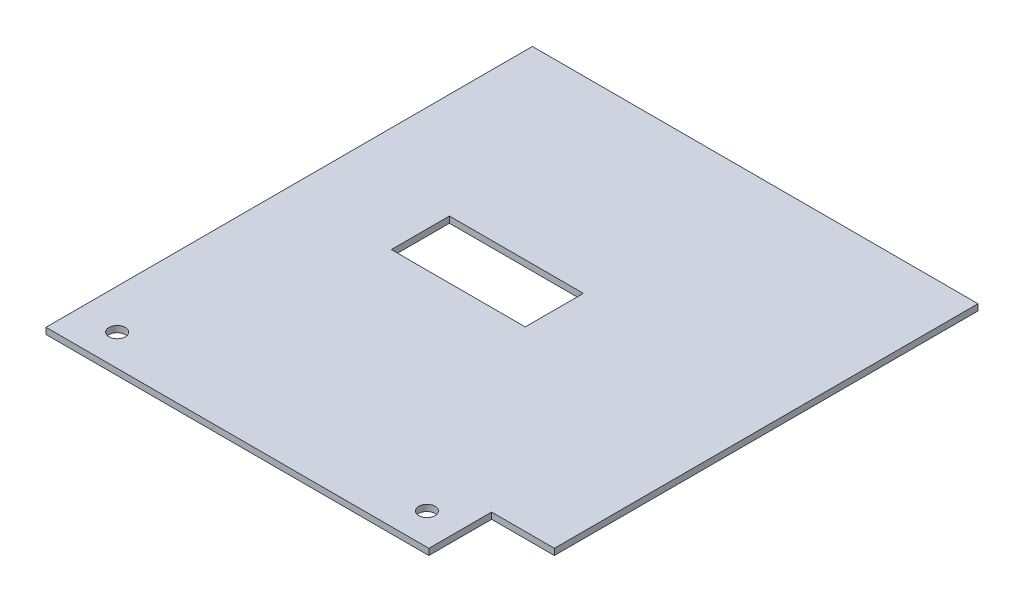
ISO-10303-21;
HEADER;
FILE_DESCRIPTION(('STEP AP214'),'2;1');
FILE_NAME('part.step','',(''),(''),'','','');
FILE_SCHEMA(('AUTOMOTIVE_DESIGN { 1 0 10303 214 1 1 1 1 }'));
ENDSEC;
DATA;
#1=APPLICATION_CONTEXT('core data for automotive mechanical design processes');
#2=APPLICATION_PROTOCOL_DEFINITION('international standard','automotive_design',2000,#1);
#3=PRODUCT_CONTEXT('',#1,'mechanical');
#4=PRODUCT('Part','Part','',(#3));
#5=PRODUCT_RELATED_PRODUCT_CATEGORY('part','',(#4));
#6=PRODUCT_DEFINITION_FORMATION('','',#4);
#7=PRODUCT_DEFINITION_CONTEXT('part definition',#1,'design');
#8=PRODUCT_DEFINITION('design','',#6,#7);
#9=PRODUCT_DEFINITION_SHAPE('','',#8);
#10=(LENGTH_UNIT() NAMED_UNIT(*) SI_UNIT(.MILLI.,.METRE.));
#11=(NAMED_UNIT(*) PLANE_ANGLE_UNIT() SI_UNIT($,.RADIAN.));
#12=(NAMED_UNIT(*) SI_UNIT($,.STERADIAN.) SOLID_ANGLE_UNIT());
#13=UNCERTAINTY_MEASURE_WITH_UNIT(LENGTH_MEASURE(1.E-05),#10,'distance_accuracy_value','');
#14=(GEOMETRIC_REPRESENTATION_CONTEXT(3) GLOBAL_UNCERTAINTY_ASSIGNED_CONTEXT((#13)) GLOBAL_UNIT_ASSIGNED_CONTEXT((#10,
#11,#12)) REPRESENTATION_CONTEXT('',''));
#15=CARTESIAN_POINT('',(0.,0.,0.));
#16=DIRECTION('',(0.,0.,1.));
#17=DIRECTION('',(1.,0.,0.));
#18=AXIS2_PLACEMENT_3D('',#15,#16,#17);
#19=CARTESIAN_POINT('',(-70.0456120409134,2.,76.4582384953632));
#20=DIRECTION('',(1.,0.,0.));
#21=DIRECTION('',(0.,0.,-1.));
#22=AXIS2_PLACEMENT_3D('',#19,#20,#21);
#23=PLANE('',#22);
#24=DIRECTION('',(0.,0.,1.));
#25=VECTOR('',#24,1.);
#26=CARTESIAN_POINT('',(-70.0456120409134,0.,76.4582384953632));
#27=LINE('',#26,#25);
#28=CARTESIAN_POINT('',(-70.0456120409134,0.,-78.5417615046368));
#29=VERTEX_POINT('',#28);
#30=CARTESIAN_POINT('',(-70.0456120409134,0.,76.4582384953632));
#31=VERTEX_POINT('',#30);
#32=EDGE_CURVE('E146',#29,#31,#27,.T.);
#33=ORIENTED_EDGE('',*,*,#32,.T.);
#34=DIRECTION('',(0.,-1.,0.));
#35=VECTOR('',#34,1.);
#36=CARTESIAN_POINT('',(-70.0456120409134,2.,76.4582384953632));
#37=LINE('',#36,#35);
#38=CARTESIAN_POINT('',(-70.0456120409134,2.,76.4582384953632));
#39=VERTEX_POINT('',#38);
#40=EDGE_CURVE('E11',#39,#31,#37,.T.);
#41=ORIENTED_EDGE('',*,*,#40,.F.);
#42=DIRECTION('',(0.,0.,1.));
#43=VECTOR('',#42,1.);
#44=CARTESIAN_POINT('',(-70.0456120409134,2.,76.4582384953632));
#45=LINE('',#44,#43);
#46=CARTESIAN_POINT('',(-70.0456120409134,2.,-78.5417615046368));
#47=VERTEX_POINT('',#46);
#48=EDGE_CURVE('E150',#47,#39,#45,.T.);
#49=ORIENTED_EDGE('',*,*,#48,.F.);
#50=DIRECTION('',(0.,-1.,0.));
#51=VECTOR('',#50,1.);
#52=CARTESIAN_POINT('',(-70.0456120409134,2.,-78.5417615046368));
#53=LINE('',#52,#51);
#54=EDGE_CURVE('E164',#47,#29,#53,.T.);
#55=ORIENTED_EDGE('',*,*,#54,.T.);
#56=EDGE_LOOP('',(#33,#41,#49,#55));
#57=FACE_BOUND('',#56,.T.);
#58=ADVANCED_FACE('F33',(#57),#23,.F.);
#59=CARTESIAN_POINT('',(51.9543879590866,2.,76.4582384953632));
#60=DIRECTION('',(0.,0.,-1.));
#61=DIRECTION('',(-1.,0.,0.));
#62=AXIS2_PLACEMENT_3D('',#59,#60,#61);
#63=PLANE('',#62);
#64=DIRECTION('',(1.,0.,0.));
#65=VECTOR('',#64,1.);
#66=CARTESIAN_POINT('',(51.9543879590866,0.,76.4582384953632));
#67=LINE('',#66,#65);
#68=CARTESIAN_POINT('',(51.9543879590866,0.,76.4582384953632));
#69=VERTEX_POINT('',#68);
#70=EDGE_CURVE('E167',#31,#69,#67,.T.);
#71=ORIENTED_EDGE('',*,*,#70,.T.);
#72=DIRECTION('',(0.,-1.,0.));
#73=VECTOR('',#72,1.);
#74=CARTESIAN_POINT('',(51.9543879590866,2.,76.4582384953632));
#75=LINE('',#74,#73);
#76=CARTESIAN_POINT('',(51.9543879590866,2.,76.4582384953632));
#77=VERTEX_POINT('',#76);
#78=EDGE_CURVE('E40',#77,#69,#75,.T.);
#79=ORIENTED_EDGE('',*,*,#78,.F.);
#80=DIRECTION('',(1.,0.,0.));
#81=VECTOR('',#80,1.);
#82=CARTESIAN_POINT('',(51.9543879590866,2.,76.4582384953632));
#83=LINE('',#82,#81);
#84=EDGE_CURVE('E153',#39,#77,#83,.T.);
#85=ORIENTED_EDGE('',*,*,#84,.F.);
#86=ORIENTED_EDGE('',*,*,#40,.T.);
#87=EDGE_LOOP('',(#71,#79,#85,#86));
#88=FACE_BOUND('',#87,.T.);
#89=ADVANCED_FACE('F212',(#88),#63,.F.);
#90=CARTESIAN_POINT('',(51.9543879590866,2.,76.4582384953632));
#91=DIRECTION('',(-1.,0.,0.));
#92=DIRECTION('',(0.,0.,1.));
#93=AXIS2_PLACEMENT_3D('',#90,#91,#92);
#94=PLANE('',#93);
#95=DIRECTION('',(0.,0.,-1.));
#96=VECTOR('',#95,1.);
#97=CARTESIAN_POINT('',(51.9543879590866,0.,76.4582384953632));
#98=LINE('',#97,#96);
#99=CARTESIAN_POINT('',(51.9543879590866,0.,56.4582384953632));
#100=VERTEX_POINT('',#99);
#101=EDGE_CURVE('E169',#69,#100,#98,.T.);
#102=ORIENTED_EDGE('',*,*,#101,.T.);
#103=DIRECTION('',(0.,-1.,0.));
#104=VECTOR('',#103,1.);
#105=CARTESIAN_POINT('',(51.9543879590866,2.,56.4582384953632));
#106=LINE('',#105,#104);
#107=CARTESIAN_POINT('',(51.9543879590866,2.,56.4582384953632));
#108=VERTEX_POINT('',#107);
#109=EDGE_CURVE('E184',#108,#100,#106,.T.);
#110=ORIENTED_EDGE('',*,*,#109,.F.);
#111=DIRECTION('',(0.,0.,-1.));
#112=VECTOR('',#111,1.);
#113=CARTESIAN_POINT('',(51.9543879590866,2.,76.4582384953632));
#114=LINE('',#113,#112);
#115=EDGE_CURVE('E156',#77,#108,#114,.T.);
#116=ORIENTED_EDGE('',*,*,#115,.F.);
#117=ORIENTED_EDGE('',*,*,#78,.T.);
#118=EDGE_LOOP('',(#102,#110,#116,#117));
#119=FACE_BOUND('',#118,.T.);
#120=ADVANCED_FACE('F191',(#119),#94,.F.);
#121=CARTESIAN_POINT('',(71.9543879590866,2.,56.4582384953632));
#122=DIRECTION('',(0.,0.,-1.));
#123=DIRECTION('',(-1.,0.,0.));
#124=AXIS2_PLACEMENT_3D('',#121,#122,#123);
#125=PLANE('',#124);
#126=DIRECTION('',(1.,0.,0.));
#127=VECTOR('',#126,1.);
#128=CARTESIAN_POINT('',(71.9543879590866,0.,56.4582384953632));
#129=LINE('',#128,#127);
#130=CARTESIAN_POINT('',(71.9543879590866,0.,56.4582384953632));
#131=VERTEX_POINT('',#130);
#132=EDGE_CURVE('E171',#100,#131,#129,.T.);
#133=ORIENTED_EDGE('',*,*,#132,.T.);
#134=DIRECTION('',(0.,-1.,0.));
#135=VECTOR('',#134,1.);
#136=CARTESIAN_POINT('',(71.9543879590866,2.,56.4582384953632));
#137=LINE('',#136,#135);
#138=CARTESIAN_POINT('',(71.9543879590866,2.,56.4582384953632));
#139=VERTEX_POINT('',#138);
#140=EDGE_CURVE('E181',#139,#131,#137,.T.);
#141=ORIENTED_EDGE('',*,*,#140,.F.);
#142=DIRECTION('',(1.,0.,0.));
#143=VECTOR('',#142,1.);
#144=CARTESIAN_POINT('',(71.9543879590866,2.,56.4582384953632));
#145=LINE('',#144,#143);
#146=EDGE_CURVE('E158',#108,#139,#145,.T.);
#147=ORIENTED_EDGE('',*,*,#146,.F.);
#148=ORIENTED_EDGE('',*,*,#109,.T.);
#149=EDGE_LOOP('',(#133,#141,#147,#148));
#150=FACE_BOUND('',#149,.T.);
#151=ADVANCED_FACE('F200',(#150),#125,.F.);
#152=CARTESIAN_POINT('',(71.9543879590866,2.,56.4582384953632));
#153=DIRECTION('',(-1.,0.,0.));
#154=DIRECTION('',(0.,0.,1.));
#155=AXIS2_PLACEMENT_3D('',#152,#153,#154);
#156=PLANE('',#155);
#157=DIRECTION('',(0.,0.,-1.));
#158=VECTOR('',#157,1.);
#159=CARTESIAN_POINT('',(71.9543879590866,0.,56.4582384953632));
#160=LINE('',#159,#158);
#161=CARTESIAN_POINT('',(71.9543879590866,0.,-78.5417615046368));
#162=VERTEX_POINT('',#161);
#163=EDGE_CURVE('E173',#131,#162,#160,.T.);
#164=ORIENTED_EDGE('',*,*,#163,.T.);
#165=DIRECTION('',(0.,-1.,0.));
#166=VECTOR('',#165,1.);
#167=CARTESIAN_POINT('',(71.9543879590866,2.,-78.5417615046368));
#168=LINE('',#167,#166);
#169=CARTESIAN_POINT('',(71.9543879590866,2.,-78.5417615046368));
#170=VERTEX_POINT('',#169);
#171=EDGE_CURVE('E178',#170,#162,#168,.T.);
#172=ORIENTED_EDGE('',*,*,#171,.F.);
#173=DIRECTION('',(0.,0.,-1.));
#174=VECTOR('',#173,1.);
#175=CARTESIAN_POINT('',(71.9543879590866,2.,56.4582384953632));
#176=LINE('',#175,#174);
#177=EDGE_CURVE('E160',#139,#170,#176,.T.);
#178=ORIENTED_EDGE('',*,*,#177,.F.);
#179=ORIENTED_EDGE('',*,*,#140,.T.);
#180=EDGE_LOOP('',(#164,#172,#178,#179));
#181=FACE_BOUND('',#180,.T.);
#182=ADVANCED_FACE('F204',(#181),#156,.F.);
#183=CARTESIAN_POINT('',(71.9543879590866,2.,-78.5417615046368));
#184=DIRECTION('',(0.,0.,1.));
#185=DIRECTION('',(1.,0.,0.));
#186=AXIS2_PLACEMENT_3D('',#183,#184,#185);
#187=PLANE('',#186);
#188=DIRECTION('',(-1.,0.,0.));
#189=VECTOR('',#188,1.);
#190=CARTESIAN_POINT('',(71.9543879590866,0.,-78.5417615046368));
#191=LINE('',#190,#189);
#192=EDGE_CURVE('E154',#162,#29,#191,.T.);
#193=ORIENTED_EDGE('',*,*,#192,.T.);
#194=ORIENTED_EDGE('',*,*,#54,.F.);
#195=DIRECTION('',(-1.,0.,0.));
#196=VECTOR('',#195,1.);
#197=CARTESIAN_POINT('',(71.9543879590866,2.,-78.5417615046368));
#198=LINE('',#197,#196);
#199=EDGE_CURVE('E162',#170,#47,#198,.T.);
#200=ORIENTED_EDGE('',*,*,#199,.F.);
#201=ORIENTED_EDGE('',*,*,#171,.T.);
#202=EDGE_LOOP('',(#193,#194,#200,#201));
#203=FACE_BOUND('',#202,.T.);
#204=ADVANCED_FACE('F215',(#203),#187,.F.);
#205=CARTESIAN_POINT('',(0.,2.,0.));
#206=DIRECTION('',(0.,1.,0.));
#207=DIRECTION('',(0.,0.,1.));
#208=AXIS2_PLACEMENT_3D('',#205,#206,#207);
#209=PLANE('',#208);
#210=CARTESIAN_POINT('',(41.3378459643878,2.,66.4582384953632));
#211=DIRECTION('',(0.,-1.,0.));
#212=DIRECTION('',(0.,0.,-1.));
#213=AXIS2_PLACEMENT_3D('',#210,#211,#212);
#214=CIRCLE('',#213,2.6);
#215=CARTESIAN_POINT('',(41.3378459643878,2.,63.8582384953632));
#216=VERTEX_POINT('',#215);
#217=EDGE_CURVE('E140',#216,#216,#214,.T.);
#218=ORIENTED_EDGE('',*,*,#217,.T.);
#219=EDGE_LOOP('',(#218));
#220=FACE_BOUND('',#219,.T.);
#221=CARTESIAN_POINT('',(-57.370433400223,2.,66.4582384953632));
#222=DIRECTION('',(0.,-1.,0.));
#223=DIRECTION('',(0.,0.,-1.));
#224=AXIS2_PLACEMENT_3D('',#221,#222,#223);
#225=CIRCLE('',#224,2.6);
#226=CARTESIAN_POINT('',(-57.370433400223,2.,63.8582384953632));
#227=VERTEX_POINT('',#226);
#228=EDGE_CURVE('E323',#227,#227,#225,.T.);
#229=ORIENTED_EDGE('',*,*,#228,.T.);
#230=EDGE_LOOP('',(#229));
#231=FACE_BOUND('',#230,.T.);
#232=DIRECTION('',(0.,0.,-1.));
#233=VECTOR('',#232,1.);
#234=CARTESIAN_POINT('',(6.21509451052304,2.,-18.521827686925));
#235=LINE('',#234,#233);
#236=CARTESIAN_POINT('',(6.21509451052305,2.,0.));
#237=VERTEX_POINT('',#236);
#238=CARTESIAN_POINT('',(6.21509451052304,2.,-18.521827686925));
#239=VERTEX_POINT('',#238);
#240=EDGE_CURVE('E47',#237,#239,#235,.T.);
#241=ORIENTED_EDGE('',*,*,#240,.F.);
#242=DIRECTION('',(1.,0.,0.));
#243=VECTOR('',#242,1.);
#244=CARTESIAN_POINT('',(6.21509451052305,2.,0.));
#245=LINE('',#244,#243);
#246=CARTESIAN_POINT('',(-36.4702029381903,2.,0.));
#247=VERTEX_POINT('',#246);
#248=EDGE_CURVE('E127',#247,#237,#245,.T.);
#249=ORIENTED_EDGE('',*,*,#248,.F.);
#250=DIRECTION('',(0.,0.,1.));
#251=VECTOR('',#250,1.);
#252=CARTESIAN_POINT('',(-36.4702029381903,2.,-18.521827686925));
#253=LINE('',#252,#251);
#254=CARTESIAN_POINT('',(-36.4702029381903,2.,-18.521827686925));
#255=VERTEX_POINT('',#254);
#256=EDGE_CURVE('E130',#255,#247,#253,.T.);
#257=ORIENTED_EDGE('',*,*,#256,.F.);
#258=DIRECTION('',(-1.,0.,0.));
#259=VECTOR('',#258,1.);
#260=CARTESIAN_POINT('',(6.21509451052304,2.,-18.521827686925));
#261=LINE('',#260,#259);
#262=EDGE_CURVE('E139',#239,#255,#261,.T.);
#263=ORIENTED_EDGE('',*,*,#262,.F.);
#264=EDGE_LOOP('',(#241,#249,#257,#263));
#265=FACE_BOUND('',#264,.T.);
#266=ORIENTED_EDGE('',*,*,#48,.T.);
#267=ORIENTED_EDGE('',*,*,#84,.T.);
#268=ORIENTED_EDGE('',*,*,#115,.T.);
#269=ORIENTED_EDGE('',*,*,#146,.T.);
#270=ORIENTED_EDGE('',*,*,#177,.T.);
#271=ORIENTED_EDGE('',*,*,#199,.T.);
#272=EDGE_LOOP('',(#266,#267,#268,#269,#270,#271));
#273=FACE_BOUND('',#272,.T.);
#274=ADVANCED_FACE('F208',(#220,#231,#265,#273),#209,.T.);
#275=CARTESIAN_POINT('',(0.,0.,0.));
#276=DIRECTION('',(0.,1.,0.));
#277=DIRECTION('',(0.,0.,1.));
#278=AXIS2_PLACEMENT_3D('',#275,#276,#277);
#279=PLANE('',#278);
#280=CARTESIAN_POINT('',(41.3378459643878,0.,66.4582384953632));
#281=DIRECTION('',(0.,-1.,0.));
#282=DIRECTION('',(0.,0.,-1.));
#283=AXIS2_PLACEMENT_3D('',#280,#281,#282);
#284=CIRCLE('',#283,2.6);
#285=CARTESIAN_POINT('',(41.3378459643878,0.,63.8582384953632));
#286=VERTEX_POINT('',#285);
#287=EDGE_CURVE('E322',#286,#286,#284,.T.);
#288=ORIENTED_EDGE('',*,*,#287,.F.);
#289=EDGE_LOOP('',(#288));
#290=FACE_BOUND('',#289,.T.);
#291=CARTESIAN_POINT('',(-57.370433400223,0.,66.4582384953632));
#292=DIRECTION('',(0.,-1.,0.));
#293=DIRECTION('',(0.,0.,-1.));
#294=AXIS2_PLACEMENT_3D('',#291,#292,#293);
#295=CIRCLE('',#294,2.6);
#296=CARTESIAN_POINT('',(-57.370433400223,0.,63.8582384953632));
#297=VERTEX_POINT('',#296);
#298=EDGE_CURVE('E133',#297,#297,#295,.T.);
#299=ORIENTED_EDGE('',*,*,#298,.F.);
#300=EDGE_LOOP('',(#299));
#301=FACE_BOUND('',#300,.T.);
#302=DIRECTION('',(1.,0.,0.));
#303=VECTOR('',#302,1.);
#304=CARTESIAN_POINT('',(6.21509451052305,0.,0.));
#305=LINE('',#304,#303);
#306=CARTESIAN_POINT('',(-36.4702029381903,0.,0.));
#307=VERTEX_POINT('',#306);
#308=CARTESIAN_POINT('',(6.21509451052305,0.,0.));
#309=VERTEX_POINT('',#308);
#310=EDGE_CURVE('E117',#307,#309,#305,.T.);
#311=ORIENTED_EDGE('',*,*,#310,.T.);
#312=DIRECTION('',(0.,0.,-1.));
#313=VECTOR('',#312,1.);
#314=CARTESIAN_POINT('',(6.21509451052304,0.,-18.521827686925));
#315=LINE('',#314,#313);
#316=CARTESIAN_POINT('',(6.21509451052304,0.,-18.521827686925));
#317=VERTEX_POINT('',#316);
#318=EDGE_CURVE('E111',#309,#317,#315,.T.);
#319=ORIENTED_EDGE('',*,*,#318,.T.);
#320=DIRECTION('',(-1.,0.,0.));
#321=VECTOR('',#320,1.);
#322=CARTESIAN_POINT('',(6.21509451052304,0.,-18.521827686925));
#323=LINE('',#322,#321);
#324=CARTESIAN_POINT('',(-36.4702029381903,0.,-18.521827686925));
#325=VERTEX_POINT('',#324);
#326=EDGE_CURVE('E120',#317,#325,#323,.T.);
#327=ORIENTED_EDGE('',*,*,#326,.T.);
#328=DIRECTION('',(0.,0.,1.));
#329=VECTOR('',#328,1.);
#330=CARTESIAN_POINT('',(-36.4702029381903,0.,-18.521827686925));
#331=LINE('',#330,#329);
#332=EDGE_CURVE('E55',#325,#307,#331,.T.);
#333=ORIENTED_EDGE('',*,*,#332,.T.);
#334=EDGE_LOOP('',(#311,#319,#327,#333));
#335=FACE_BOUND('',#334,.T.);
#336=ORIENTED_EDGE('',*,*,#32,.F.);
#337=ORIENTED_EDGE('',*,*,#192,.F.);
#338=ORIENTED_EDGE('',*,*,#163,.F.);
#339=ORIENTED_EDGE('',*,*,#132,.F.);
#340=ORIENTED_EDGE('',*,*,#101,.F.);
#341=ORIENTED_EDGE('',*,*,#70,.F.);
#342=EDGE_LOOP('',(#336,#337,#338,#339,#340,#341));
#343=FACE_BOUND('',#342,.T.);
#344=ADVANCED_FACE('F124',(#290,#301,#335,#343),#279,.F.);
#345=CARTESIAN_POINT('',(6.21509451052304,0.,-18.521827686925));
#346=DIRECTION('',(1.,0.,0.));
#347=DIRECTION('',(0.,0.,-1.));
#348=AXIS2_PLACEMENT_3D('',#345,#346,#347);
#349=PLANE('',#348);
#350=ORIENTED_EDGE('',*,*,#240,.T.);
#351=DIRECTION('',(0.,1.,0.));
#352=VECTOR('',#351,1.);
#353=CARTESIAN_POINT('',(6.21509451052304,0.,-18.521827686925));
#354=LINE('',#353,#352);
#355=EDGE_CURVE('E107',#317,#239,#354,.T.);
#356=ORIENTED_EDGE('',*,*,#355,.F.);
#357=ORIENTED_EDGE('',*,*,#318,.F.);
#358=DIRECTION('',(0.,1.,0.));
#359=VECTOR('',#358,1.);
#360=CARTESIAN_POINT('',(6.21509451052305,0.,0.));
#361=LINE('',#360,#359);
#362=EDGE_CURVE('E144',#309,#237,#361,.T.);
#363=ORIENTED_EDGE('',*,*,#362,.T.);
#364=EDGE_LOOP('',(#350,#356,#357,#363));
#365=FACE_BOUND('',#364,.T.);
#366=ADVANCED_FACE('F109',(#365),#349,.F.);
#367=CARTESIAN_POINT('',(6.21509451052305,0.,0.));
#368=DIRECTION('',(0.,0.,1.));
#369=DIRECTION('',(1.,0.,0.));
#370=AXIS2_PLACEMENT_3D('',#367,#368,#369);
#371=PLANE('',#370);
#372=ORIENTED_EDGE('',*,*,#248,.T.);
#373=ORIENTED_EDGE('',*,*,#362,.F.);
#374=ORIENTED_EDGE('',*,*,#310,.F.);
#375=DIRECTION('',(0.,1.,0.));
#376=VECTOR('',#375,1.);
#377=CARTESIAN_POINT('',(-36.4702029381903,0.,0.));
#378=LINE('',#377,#376);
#379=EDGE_CURVE('E147',#307,#247,#378,.T.);
#380=ORIENTED_EDGE('',*,*,#379,.T.);
#381=EDGE_LOOP('',(#372,#373,#374,#380));
#382=FACE_BOUND('',#381,.T.);
#383=ADVANCED_FACE('F259',(#382),#371,.F.);
#384=CARTESIAN_POINT('',(-36.4702029381903,0.,-18.521827686925));
#385=DIRECTION('',(-1.,0.,0.));
#386=DIRECTION('',(0.,0.,1.));
#387=AXIS2_PLACEMENT_3D('',#384,#385,#386);
#388=PLANE('',#387);
#389=ORIENTED_EDGE('',*,*,#256,.T.);
#390=ORIENTED_EDGE('',*,*,#379,.F.);
#391=ORIENTED_EDGE('',*,*,#332,.F.);
#392=DIRECTION('',(0.,1.,0.));
#393=VECTOR('',#392,1.);
#394=CARTESIAN_POINT('',(-36.4702029381903,0.,-18.521827686925));
#395=LINE('',#394,#393);
#396=EDGE_CURVE('E116',#325,#255,#395,.T.);
#397=ORIENTED_EDGE('',*,*,#396,.T.);
#398=EDGE_LOOP('',(#389,#390,#391,#397));
#399=FACE_BOUND('',#398,.T.);
#400=ADVANCED_FACE('F270',(#399),#388,.F.);
#401=CARTESIAN_POINT('',(6.21509451052304,0.,-18.521827686925));
#402=DIRECTION('',(0.,0.,-1.));
#403=DIRECTION('',(-1.,0.,0.));
#404=AXIS2_PLACEMENT_3D('',#401,#402,#403);
#405=PLANE('',#404);
#406=ORIENTED_EDGE('',*,*,#262,.T.);
#407=ORIENTED_EDGE('',*,*,#396,.F.);
#408=ORIENTED_EDGE('',*,*,#326,.F.);
#409=ORIENTED_EDGE('',*,*,#355,.T.);
#410=EDGE_LOOP('',(#406,#407,#408,#409));
#411=FACE_BOUND('',#410,.T.);
#412=ADVANCED_FACE('F121',(#411),#405,.F.);
#413=CARTESIAN_POINT('',(-57.370433400223,2.,66.4582384953632));
#414=DIRECTION('',(0.,-1.,0.));
#415=DIRECTION('',(0.,0.,-1.));
#416=AXIS2_PLACEMENT_3D('',#413,#414,#415);
#417=CYLINDRICAL_SURFACE('',#416,2.6);
#418=ORIENTED_EDGE('',*,*,#228,.F.);
#419=EDGE_LOOP('',(#418));
#420=FACE_BOUND('',#419,.T.);
#421=ORIENTED_EDGE('',*,*,#298,.T.);
#422=EDGE_LOOP('',(#421));
#423=FACE_BOUND('',#422,.T.);
#424=ADVANCED_FACE('F287',(#420,#423),#417,.F.);
#425=CARTESIAN_POINT('',(41.3378459643878,2.,66.4582384953632));
#426=DIRECTION('',(0.,-1.,0.));
#427=DIRECTION('',(0.,0.,-1.));
#428=AXIS2_PLACEMENT_3D('',#425,#426,#427);
#429=CYLINDRICAL_SURFACE('',#428,2.6);
#430=ORIENTED_EDGE('',*,*,#217,.F.);
#431=EDGE_LOOP('',(#430));
#432=FACE_BOUND('',#431,.T.);
#433=ORIENTED_EDGE('',*,*,#287,.T.);
#434=EDGE_LOOP('',(#433));
#435=FACE_BOUND('',#434,.T.);
#436=ADVANCED_FACE('F303',(#432,#435),#429,.F.);
#437=CLOSED_SHELL('',(#58,#89,#120,#151,#182,#204,#274,#344,#366,#383,#400,#412,#424,#436));
#438=MANIFOLD_SOLID_BREP('B2',#437);
#439=ADVANCED_BREP_SHAPE_REPRESENTATION('',(#18,#438),#14);
#440=SHAPE_DEFINITION_REPRESENTATION(#9,#439);
ENDSEC;
END-ISO-10303-21;
